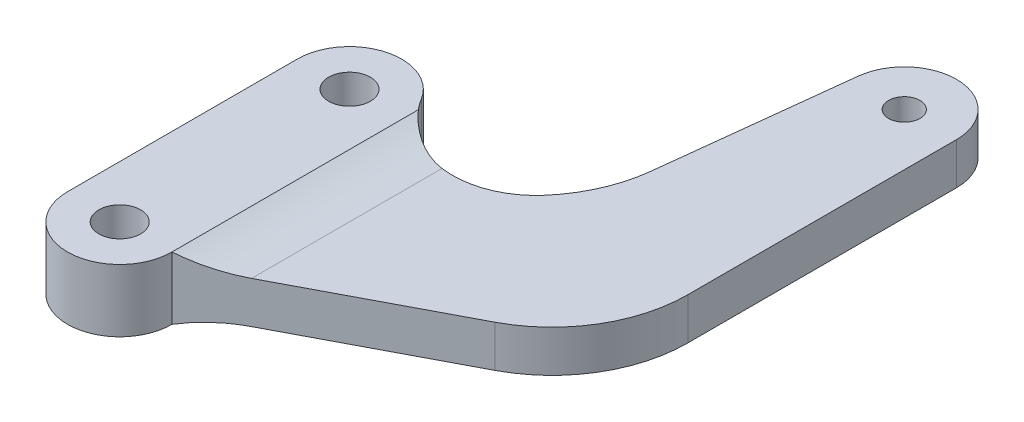
ISO-10303-21;
HEADER;
FILE_DESCRIPTION(('STEP AP214'),'2;1');
FILE_NAME('part.step','',(''),(''),'','','');
FILE_SCHEMA(('AUTOMOTIVE_DESIGN { 1 0 10303 214 1 1 1 1 }'));
ENDSEC;
DATA;
#1=APPLICATION_CONTEXT('core data for automotive mechanical design processes');
#2=APPLICATION_PROTOCOL_DEFINITION('international standard','automotive_design',2000,#1);
#3=PRODUCT_CONTEXT('',#1,'mechanical');
#4=PRODUCT('Part','Part','',(#3));
#5=PRODUCT_RELATED_PRODUCT_CATEGORY('part','',(#4));
#6=PRODUCT_DEFINITION_FORMATION('','',#4);
#7=PRODUCT_DEFINITION_CONTEXT('part definition',#1,'design');
#8=PRODUCT_DEFINITION('design','',#6,#7);
#9=PRODUCT_DEFINITION_SHAPE('','',#8);
#10=(LENGTH_UNIT() NAMED_UNIT(*) SI_UNIT(.MILLI.,.METRE.));
#11=(NAMED_UNIT(*) PLANE_ANGLE_UNIT() SI_UNIT($,.RADIAN.));
#12=(NAMED_UNIT(*) SI_UNIT($,.STERADIAN.) SOLID_ANGLE_UNIT());
#13=UNCERTAINTY_MEASURE_WITH_UNIT(LENGTH_MEASURE(1.E-05),#10,'distance_accuracy_value','');
#14=(GEOMETRIC_REPRESENTATION_CONTEXT(3) GLOBAL_UNCERTAINTY_ASSIGNED_CONTEXT((#13)) GLOBAL_UNIT_ASSIGNED_CONTEXT((#10,
#11,#12)) REPRESENTATION_CONTEXT('',''));
#15=CARTESIAN_POINT('',(0.,0.,0.));
#16=DIRECTION('',(0.,0.,1.));
#17=DIRECTION('',(1.,0.,0.));
#18=AXIS2_PLACEMENT_3D('',#15,#16,#17);
#19=CARTESIAN_POINT('',(0.,-3.,-11.));
#20=DIRECTION('',(0.,1.,0.));
#21=DIRECTION('',(0.,0.,1.));
#22=AXIS2_PLACEMENT_3D('',#19,#20,#21);
#23=CYLINDRICAL_SURFACE('',#22,5.);
#24=CARTESIAN_POINT('',(0.,3.,-11.));
#25=DIRECTION('',(0.,1.,0.));
#26=DIRECTION('',(0.,0.,1.));
#27=AXIS2_PLACEMENT_3D('',#24,#25,#26);
#28=CIRCLE('',#27,5.);
#29=CARTESIAN_POINT('',(4.2649345360818,3.,-13.6096615494996));
#30=VERTEX_POINT('',#29);
#31=CARTESIAN_POINT('',(-5.,3.,-11.));
#32=VERTEX_POINT('',#31);
#33=EDGE_CURVE('E181',#30,#32,#28,.T.);
#34=ORIENTED_EDGE('',*,*,#33,.F.);
#35=DIRECTION('',(0.,1.,0.));
#36=VECTOR('',#35,1.);
#37=CARTESIAN_POINT('',(4.2649345360818,-3.,-13.6096615494996));
#38=LINE('',#37,#36);
#39=CARTESIAN_POINT('',(4.2649345360818,-3.,-13.6096615494996));
#40=VERTEX_POINT('',#39);
#41=EDGE_CURVE('E244',#30,#40,#38,.F.);
#42=ORIENTED_EDGE('',*,*,#41,.T.);
#43=CARTESIAN_POINT('',(0.,-3.,-11.));
#44=DIRECTION('',(0.,1.,0.));
#45=DIRECTION('',(0.,0.,1.));
#46=AXIS2_PLACEMENT_3D('',#43,#44,#45);
#47=CIRCLE('',#46,5.);
#48=CARTESIAN_POINT('',(-5.,-3.,-11.));
#49=VERTEX_POINT('',#48);
#50=EDGE_CURVE('E198',#40,#49,#47,.T.);
#51=ORIENTED_EDGE('',*,*,#50,.T.);
#52=DIRECTION('',(0.,1.,0.));
#53=VECTOR('',#52,1.);
#54=CARTESIAN_POINT('',(-5.,-3.,-11.));
#55=LINE('',#54,#53);
#56=EDGE_CURVE('E210',#49,#32,#55,.T.);
#57=ORIENTED_EDGE('',*,*,#56,.T.);
#58=EDGE_LOOP('',(#34,#42,#51,#57));
#59=FACE_BOUND('',#58,.T.);
#60=ADVANCED_FACE('F35',(#59),#23,.T.);
#61=CARTESIAN_POINT('',(0.,-3.,11.));
#62=DIRECTION('',(0.,1.,0.));
#63=DIRECTION('',(0.,0.,1.));
#64=AXIS2_PLACEMENT_3D('',#61,#62,#63);
#65=CYLINDRICAL_SURFACE('',#64,5.);
#66=DIRECTION('',(0.,1.,0.));
#67=VECTOR('',#66,1.);
#68=CARTESIAN_POINT('',(5.,-3.,11.));
#69=LINE('',#68,#67);
#70=CARTESIAN_POINT('',(5.,-3.,11.));
#71=VERTEX_POINT('',#70);
#72=CARTESIAN_POINT('',(5.,3.,11.));
#73=VERTEX_POINT('',#72);
#74=EDGE_CURVE('E211',#71,#73,#69,.T.);
#75=ORIENTED_EDGE('',*,*,#74,.T.);
#76=CARTESIAN_POINT('',(0.,3.,11.));
#77=DIRECTION('',(0.,1.,0.));
#78=DIRECTION('',(0.,0.,1.));
#79=AXIS2_PLACEMENT_3D('',#76,#77,#78);
#80=CIRCLE('',#79,5.);
#81=CARTESIAN_POINT('',(-5.,3.,11.));
#82=VERTEX_POINT('',#81);
#83=EDGE_CURVE('E186',#82,#73,#80,.T.);
#84=ORIENTED_EDGE('',*,*,#83,.F.);
#85=DIRECTION('',(0.,1.,0.));
#86=VECTOR('',#85,1.);
#87=CARTESIAN_POINT('',(-5.,-3.,11.));
#88=LINE('',#87,#86);
#89=CARTESIAN_POINT('',(-5.,-3.,11.));
#90=VERTEX_POINT('',#89);
#91=EDGE_CURVE('E214',#90,#82,#88,.T.);
#92=ORIENTED_EDGE('',*,*,#91,.F.);
#93=CARTESIAN_POINT('',(0.,-3.,11.));
#94=DIRECTION('',(0.,1.,0.));
#95=DIRECTION('',(0.,0.,1.));
#96=AXIS2_PLACEMENT_3D('',#93,#94,#95);
#97=CIRCLE('',#96,5.);
#98=EDGE_CURVE('E203',#90,#71,#97,.T.);
#99=ORIENTED_EDGE('',*,*,#98,.T.);
#100=EDGE_LOOP('',(#75,#84,#92,#99));
#101=FACE_BOUND('',#100,.T.);
#102=ADVANCED_FACE('F280',(#101),#65,.T.);
#103=CARTESIAN_POINT('',(-5.,-3.,0.));
#104=DIRECTION('',(-1.,0.,0.));
#105=DIRECTION('',(0.,0.,1.));
#106=AXIS2_PLACEMENT_3D('',#103,#104,#105);
#107=PLANE('',#106);
#108=ORIENTED_EDGE('',*,*,#91,.T.);
#109=DIRECTION('',(0.,0.,1.));
#110=VECTOR('',#109,1.);
#111=CARTESIAN_POINT('',(-5.,3.,0.));
#112=LINE('',#111,#110);
#113=EDGE_CURVE('E183',#32,#82,#112,.T.);
#114=ORIENTED_EDGE('',*,*,#113,.F.);
#115=ORIENTED_EDGE('',*,*,#56,.F.);
#116=DIRECTION('',(0.,0.,1.));
#117=VECTOR('',#116,1.);
#118=CARTESIAN_POINT('',(-5.,-3.,0.));
#119=LINE('',#118,#117);
#120=EDGE_CURVE('E200',#49,#90,#119,.T.);
#121=ORIENTED_EDGE('',*,*,#120,.T.);
#122=EDGE_LOOP('',(#108,#114,#115,#121));
#123=FACE_BOUND('',#122,.T.);
#124=ADVANCED_FACE('F286',(#123),#107,.T.);
#125=CARTESIAN_POINT('',(0.,-3.,11.));
#126=DIRECTION('',(0.,1.,0.));
#127=DIRECTION('',(0.,0.,1.));
#128=AXIS2_PLACEMENT_3D('',#125,#126,#127);
#129=CYLINDRICAL_SURFACE('',#128,2.);
#130=CARTESIAN_POINT('',(0.,-3.,11.));
#131=DIRECTION('',(0.,1.,0.));
#132=DIRECTION('',(0.,0.,1.));
#133=AXIS2_PLACEMENT_3D('',#130,#131,#132);
#134=CIRCLE('',#133,2.);
#135=CARTESIAN_POINT('',(0.,-3.,13.));
#136=VERTEX_POINT('',#135);
#137=EDGE_CURVE('E195',#136,#136,#134,.T.);
#138=ORIENTED_EDGE('',*,*,#137,.F.);
#139=EDGE_LOOP('',(#138));
#140=FACE_BOUND('',#139,.T.);
#141=CARTESIAN_POINT('',(0.,3.,11.));
#142=DIRECTION('',(0.,1.,0.));
#143=DIRECTION('',(0.,0.,1.));
#144=AXIS2_PLACEMENT_3D('',#141,#142,#143);
#145=CIRCLE('',#144,2.);
#146=CARTESIAN_POINT('',(0.,3.,13.));
#147=VERTEX_POINT('',#146);
#148=EDGE_CURVE('E177',#147,#147,#145,.T.);
#149=ORIENTED_EDGE('',*,*,#148,.T.);
#150=EDGE_LOOP('',(#149));
#151=FACE_BOUND('',#150,.T.);
#152=ADVANCED_FACE('F291',(#140,#151),#129,.F.);
#153=CARTESIAN_POINT('',(0.,-3.,-11.));
#154=DIRECTION('',(0.,1.,0.));
#155=DIRECTION('',(0.,0.,1.));
#156=AXIS2_PLACEMENT_3D('',#153,#154,#155);
#157=CYLINDRICAL_SURFACE('',#156,2.);
#158=CARTESIAN_POINT('',(0.,-3.,-11.));
#159=DIRECTION('',(0.,1.,0.));
#160=DIRECTION('',(0.,0.,1.));
#161=AXIS2_PLACEMENT_3D('',#158,#159,#160);
#162=CIRCLE('',#161,2.);
#163=CARTESIAN_POINT('',(0.,-3.,-9.));
#164=VERTEX_POINT('',#163);
#165=EDGE_CURVE('E207',#164,#164,#162,.T.);
#166=ORIENTED_EDGE('',*,*,#165,.F.);
#167=EDGE_LOOP('',(#166));
#168=FACE_BOUND('',#167,.T.);
#169=CARTESIAN_POINT('',(0.,3.,-11.));
#170=DIRECTION('',(0.,1.,0.));
#171=DIRECTION('',(0.,0.,1.));
#172=AXIS2_PLACEMENT_3D('',#169,#170,#171);
#173=CIRCLE('',#172,2.);
#174=CARTESIAN_POINT('',(0.,3.,-9.));
#175=VERTEX_POINT('',#174);
#176=EDGE_CURVE('E192',#175,#175,#173,.T.);
#177=ORIENTED_EDGE('',*,*,#176,.T.);
#178=EDGE_LOOP('',(#177));
#179=FACE_BOUND('',#178,.T.);
#180=ADVANCED_FACE('F293',(#168,#179),#157,.F.);
#181=CARTESIAN_POINT('',(0.,-3.,0.));
#182=DIRECTION('',(0.,1.,0.));
#183=DIRECTION('',(0.,0.,1.));
#184=AXIS2_PLACEMENT_3D('',#181,#182,#183);
#185=PLANE('',#184);
#186=ORIENTED_EDGE('',*,*,#137,.T.);
#187=EDGE_LOOP('',(#186));
#188=FACE_BOUND('',#187,.T.);
#189=ORIENTED_EDGE('',*,*,#50,.F.);
#190=CARTESIAN_POINT('',(11.0888297938127,-3.,-17.785120028699));
#191=DIRECTION('',(0.,1.,0.));
#192=DIRECTION('',(0.,0.,1.));
#193=AXIS2_PLACEMENT_3D('',#190,#191,#192);
#194=CIRCLE('',#193,8.);
#195=CARTESIAN_POINT('',(5.,-3.,-12.5960785235673));
#196=VERTEX_POINT('',#195);
#197=EDGE_CURVE('E319',#40,#196,#194,.T.);
#198=ORIENTED_EDGE('',*,*,#197,.T.);
#199=DIRECTION('',(0.,0.,1.));
#200=VECTOR('',#199,1.);
#201=CARTESIAN_POINT('',(5.,-3.,0.));
#202=LINE('',#201,#200);
#203=EDGE_CURVE('E51',#196,#71,#202,.T.);
#204=ORIENTED_EDGE('',*,*,#203,.T.);
#205=ORIENTED_EDGE('',*,*,#98,.F.);
#206=ORIENTED_EDGE('',*,*,#120,.F.);
#207=EDGE_LOOP('',(#189,#198,#204,#205,#206));
#208=FACE_BOUND('',#207,.T.);
#209=ORIENTED_EDGE('',*,*,#165,.T.);
#210=EDGE_LOOP('',(#209));
#211=FACE_BOUND('',#210,.T.);
#212=ADVANCED_FACE('F299',(#188,#208,#211),#185,.F.);
#213=CARTESIAN_POINT('',(0.,3.,0.));
#214=DIRECTION('',(0.,1.,0.));
#215=DIRECTION('',(0.,0.,1.));
#216=AXIS2_PLACEMENT_3D('',#213,#214,#215);
#217=PLANE('',#216);
#218=ORIENTED_EDGE('',*,*,#148,.F.);
#219=EDGE_LOOP('',(#218));
#220=FACE_BOUND('',#219,.T.);
#221=DIRECTION('',(0.,0.,1.));
#222=VECTOR('',#221,1.);
#223=CARTESIAN_POINT('',(5.,3.,0.));
#224=LINE('',#223,#222);
#225=CARTESIAN_POINT('',(5.,3.,-12.5960785235673));
#226=VERTEX_POINT('',#225);
#227=EDGE_CURVE('E189',#226,#73,#224,.T.);
#228=ORIENTED_EDGE('',*,*,#227,.F.);
#229=CARTESIAN_POINT('',(11.0888297938127,3.,-17.785120028699));
#230=DIRECTION('',(0.,1.,0.));
#231=DIRECTION('',(0.,0.,1.));
#232=AXIS2_PLACEMENT_3D('',#229,#230,#231);
#233=CIRCLE('',#232,8.);
#234=EDGE_CURVE('E257',#226,#30,#233,.F.);
#235=ORIENTED_EDGE('',*,*,#234,.T.);
#236=ORIENTED_EDGE('',*,*,#33,.T.);
#237=ORIENTED_EDGE('',*,*,#113,.T.);
#238=ORIENTED_EDGE('',*,*,#83,.T.);
#239=EDGE_LOOP('',(#228,#235,#236,#237,#238));
#240=FACE_BOUND('',#239,.T.);
#241=ORIENTED_EDGE('',*,*,#176,.F.);
#242=EDGE_LOOP('',(#241));
#243=FACE_BOUND('',#242,.T.);
#244=ADVANCED_FACE('F307',(#220,#240,#243),#217,.T.);
#245=CARTESIAN_POINT('',(32.2390337656034,-2.,0.000317918521454837));
#246=DIRECTION('',(-0.999999999951377,0.,-9.86129186596697E-06));
#247=DIRECTION('',(-9.86129186596697E-06,0.,0.999999999951377));
#248=AXIS2_PLACEMENT_3D('',#245,#246,#247);
#249=PLANE('',#248);
#250=DIRECTION('',(-9.86129186596697E-06,0.,0.999999999951378));
#251=VECTOR('',#250,1.);
#252=CARTESIAN_POINT('',(32.2390337656034,2.,0.000317918521454837));
#253=LINE('',#252,#251);
#254=CARTESIAN_POINT('',(32.2393974859949,2.,-36.8833273902187));
#255=VERTEX_POINT('',#254);
#256=CARTESIAN_POINT('',(32.2391437631779,2.,-11.1541612274217));
#257=VERTEX_POINT('',#256);
#258=EDGE_CURVE('E135',#255,#257,#253,.T.);
#259=ORIENTED_EDGE('',*,*,#258,.T.);
#260=DIRECTION('',(0.,1.,0.));
#261=VECTOR('',#260,1.);
#262=CARTESIAN_POINT('',(32.2391437631779,-2.,-11.1541612274217));
#263=LINE('',#262,#261);
#264=CARTESIAN_POINT('',(32.2391437631779,-2.,-11.1541612274217));
#265=VERTEX_POINT('',#264);
#266=EDGE_CURVE('E227',#257,#265,#263,.F.);
#267=ORIENTED_EDGE('',*,*,#266,.T.);
#268=DIRECTION('',(-9.86129186596697E-06,0.,0.999999999951378));
#269=VECTOR('',#268,1.);
#270=CARTESIAN_POINT('',(32.2390337656034,-2.,0.000317918521454837));
#271=LINE('',#270,#269);
#272=CARTESIAN_POINT('',(32.2393974859949,-2.,-36.8833273902187));
#273=VERTEX_POINT('',#272);
#274=EDGE_CURVE('E138',#273,#265,#271,.T.);
#275=ORIENTED_EDGE('',*,*,#274,.F.);
#276=DIRECTION('',(0.,1.,0.));
#277=VECTOR('',#276,1.);
#278=CARTESIAN_POINT('',(32.2393974859949,-2.,-36.8833273902187));
#279=LINE('',#278,#277);
#280=EDGE_CURVE('E131',#273,#255,#279,.T.);
#281=ORIENTED_EDGE('',*,*,#280,.T.);
#282=EDGE_LOOP('',(#259,#267,#275,#281));
#283=FACE_BOUND('',#282,.T.);
#284=ADVANCED_FACE('F133',(#283),#249,.F.);
#285=CARTESIAN_POINT('',(5.60597292340619,-2.,10.6819814935088));
#286=DIRECTION('',(-0.464699550810545,0.,-0.885468422630914));
#287=DIRECTION('',(-0.885468422630914,0.,0.464699550810545));
#288=AXIS2_PLACEMENT_3D('',#285,#286,#287);
#289=PLANE('',#288);
#290=DIRECTION('',(-0.885468422630914,0.,0.464699550810545));
#291=VECTOR('',#290,1.);
#292=CARTESIAN_POINT('',(5.60597292340619,-2.,10.6819814935088));
#293=LINE('',#292,#291);
#294=CARTESIAN_POINT('',(25.280237924347,-2.,0.356800069985893));
#295=VERTEX_POINT('',#294);
#296=CARTESIAN_POINT('',(10.,-2.,8.37596768595189));
#297=VERTEX_POINT('',#296);
#298=EDGE_CURVE('E173',#295,#297,#293,.T.);
#299=ORIENTED_EDGE('',*,*,#298,.F.);
#300=DIRECTION('',(0.,1.,0.));
#301=VECTOR('',#300,1.);
#302=CARTESIAN_POINT('',(25.280237924347,-2.,0.356800069985893));
#303=LINE('',#302,#301);
#304=CARTESIAN_POINT('',(25.280237924347,2.,0.356800069985893));
#305=VERTEX_POINT('',#304);
#306=EDGE_CURVE('E224',#295,#305,#303,.T.);
#307=ORIENTED_EDGE('',*,*,#306,.T.);
#308=DIRECTION('',(-0.885468422630914,0.,0.464699550810545));
#309=VECTOR('',#308,1.);
#310=CARTESIAN_POINT('',(5.60597292340619,2.,10.6819814935088));
#311=LINE('',#310,#309);
#312=CARTESIAN_POINT('',(10.,2.,8.37596768595189));
#313=VERTEX_POINT('',#312);
#314=EDGE_CURVE('E161',#305,#313,#311,.T.);
#315=ORIENTED_EDGE('',*,*,#314,.T.);
#316=CARTESIAN_POINT('',(10.,15.,8.37596768595189));
#317=DIRECTION('',(-0.464699550810545,0.,-0.885468422630914));
#318=DIRECTION('',(0.885468422630914,0.,-0.464699550810545));
#319=AXIS2_PLACEMENT_3D('',#316,#317,#318);
#320=ELLIPSE('',#319,14.6814947520932,13.);
#321=EDGE_CURVE('E234',#313,#73,#320,.T.);
#322=ORIENTED_EDGE('',*,*,#321,.T.);
#323=ORIENTED_EDGE('',*,*,#74,.F.);
#324=CARTESIAN_POINT('',(10.,-15.,8.37596768595189));
#325=DIRECTION('',(-0.464699550810545,0.,-0.885468422630914));
#326=DIRECTION('',(0.885468422630914,0.,-0.464699550810545));
#327=AXIS2_PLACEMENT_3D('',#324,#325,#326);
#328=ELLIPSE('',#327,14.6814947520932,13.);
#329=EDGE_CURVE('E232',#71,#297,#328,.T.);
#330=ORIENTED_EDGE('',*,*,#329,.T.);
#331=EDGE_LOOP('',(#299,#307,#315,#322,#323,#330));
#332=FACE_BOUND('',#331,.T.);
#333=ADVANCED_FACE('F337',(#332),#289,.F.);
#334=CARTESIAN_POINT('',(17.7559213878396,-2.,2.03086150987237));
#335=DIRECTION('',(-0.993522484630147,0.,-0.11363570096734));
#336=DIRECTION('',(-0.11363570096734,0.,0.993522484630147));
#337=AXIS2_PLACEMENT_3D('',#334,#335,#336);
#338=PLANE('',#337);
#339=DIRECTION('',(-0.11363570096734,0.,0.993522484630147));
#340=VECTOR('',#339,1.);
#341=CARTESIAN_POINT('',(17.7559213878396,-2.,2.03086150987237));
#342=LINE('',#341,#340);
#343=CARTESIAN_POINT('',(22.2717850630872,-2.,-37.4515552015147));
#344=VERTEX_POINT('',#343);
#345=CARTESIAN_POINT('',(20.2282593604993,-2.,-19.5849101581209));
#346=VERTEX_POINT('',#345);
#347=EDGE_CURVE('E170',#344,#346,#342,.T.);
#348=ORIENTED_EDGE('',*,*,#347,.T.);
#349=DIRECTION('',(0.,1.,0.));
#350=VECTOR('',#349,1.);
#351=CARTESIAN_POINT('',(20.2282593604993,-2.,-19.5849101581209));
#352=LINE('',#351,#350);
#353=CARTESIAN_POINT('',(20.2282593604993,2.,-19.5849101581209));
#354=VERTEX_POINT('',#353);
#355=EDGE_CURVE('E229',#346,#354,#352,.T.);
#356=ORIENTED_EDGE('',*,*,#355,.T.);
#357=DIRECTION('',(-0.11363570096734,0.,0.993522484630147));
#358=VECTOR('',#357,1.);
#359=CARTESIAN_POINT('',(17.7559213878396,2.,2.03086150987237));
#360=LINE('',#359,#358);
#361=CARTESIAN_POINT('',(22.2717850630872,2.,-37.4515552015147));
#362=VERTEX_POINT('',#361);
#363=EDGE_CURVE('E151',#362,#354,#360,.T.);
#364=ORIENTED_EDGE('',*,*,#363,.F.);
#365=DIRECTION('',(0.,1.,0.));
#366=VECTOR('',#365,1.);
#367=CARTESIAN_POINT('',(22.2717850630872,-2.,-37.4515552015147));
#368=LINE('',#367,#366);
#369=EDGE_CURVE('E142',#344,#362,#368,.T.);
#370=ORIENTED_EDGE('',*,*,#369,.F.);
#371=EDGE_LOOP('',(#348,#356,#364,#370));
#372=FACE_BOUND('',#371,.T.);
#373=ADVANCED_FACE('F334',(#372),#338,.T.);
#374=CARTESIAN_POINT('',(27.239397486238,-2.,-36.883376696678));
#375=DIRECTION('',(0.,1.,0.));
#376=DIRECTION('',(0.,0.,1.));
#377=AXIS2_PLACEMENT_3D('',#374,#375,#376);
#378=CYLINDRICAL_SURFACE('',#377,5.);
#379=ORIENTED_EDGE('',*,*,#369,.T.);
#380=CARTESIAN_POINT('',(27.239397486238,2.,-36.883376696678));
#381=DIRECTION('',(0.,1.,0.));
#382=DIRECTION('',(0.,0.,1.));
#383=AXIS2_PLACEMENT_3D('',#380,#381,#382);
#384=CIRCLE('',#383,5.);
#385=EDGE_CURVE('E146',#255,#362,#384,.T.);
#386=ORIENTED_EDGE('',*,*,#385,.F.);
#387=ORIENTED_EDGE('',*,*,#280,.F.);
#388=CARTESIAN_POINT('',(27.239397486238,-2.,-36.883376696678));
#389=DIRECTION('',(0.,1.,0.));
#390=DIRECTION('',(0.,0.,1.));
#391=AXIS2_PLACEMENT_3D('',#388,#389,#390);
#392=CIRCLE('',#391,5.);
#393=EDGE_CURVE('E168',#273,#344,#392,.T.);
#394=ORIENTED_EDGE('',*,*,#393,.T.);
#395=EDGE_LOOP('',(#379,#386,#387,#394));
#396=FACE_BOUND('',#395,.T.);
#397=ADVANCED_FACE('F147',(#396),#378,.T.);
#398=CARTESIAN_POINT('',(27.239397486238,-2.,-36.883376696678));
#399=DIRECTION('',(0.,1.,0.));
#400=DIRECTION('',(0.,0.,1.));
#401=AXIS2_PLACEMENT_3D('',#398,#399,#400);
#402=CYLINDRICAL_SURFACE('',#401,1.5);
#403=CARTESIAN_POINT('',(27.239397486238,-2.,-36.883376696678));
#404=DIRECTION('',(0.,1.,0.));
#405=DIRECTION('',(0.,0.,1.));
#406=AXIS2_PLACEMENT_3D('',#403,#404,#405);
#407=CIRCLE('',#406,1.5);
#408=CARTESIAN_POINT('',(27.239397486238,-2.,-35.383376696678));
#409=VERTEX_POINT('',#408);
#410=EDGE_CURVE('E143',#409,#409,#407,.T.);
#411=ORIENTED_EDGE('',*,*,#410,.F.);
#412=EDGE_LOOP('',(#411));
#413=FACE_BOUND('',#412,.T.);
#414=CARTESIAN_POINT('',(27.239397486238,2.,-36.883376696678));
#415=DIRECTION('',(0.,1.,0.));
#416=DIRECTION('',(0.,0.,1.));
#417=AXIS2_PLACEMENT_3D('',#414,#415,#416);
#418=CIRCLE('',#417,1.5);
#419=CARTESIAN_POINT('',(27.239397486238,2.,-35.383376696678));
#420=VERTEX_POINT('',#419);
#421=EDGE_CURVE('E164',#420,#420,#418,.T.);
#422=ORIENTED_EDGE('',*,*,#421,.T.);
#423=EDGE_LOOP('',(#422));
#424=FACE_BOUND('',#423,.T.);
#425=ADVANCED_FACE('F357',(#413,#424),#402,.F.);
#426=CARTESIAN_POINT('',(0.,-2.,0.));
#427=DIRECTION('',(0.,1.,0.));
#428=DIRECTION('',(0.,0.,1.));
#429=AXIS2_PLACEMENT_3D('',#426,#427,#428);
#430=PLANE('',#429);
#431=ORIENTED_EDGE('',*,*,#298,.T.);
#432=DIRECTION('',(0.,0.,-1.));
#433=VECTOR('',#432,1.);
#434=CARTESIAN_POINT('',(10.,-2.,0.));
#435=LINE('',#434,#433);
#436=CARTESIAN_POINT('',(10.,-2.,-9.8595632861032));
#437=VERTEX_POINT('',#436);
#438=EDGE_CURVE('E58',#297,#437,#435,.T.);
#439=ORIENTED_EDGE('',*,*,#438,.T.);
#440=CARTESIAN_POINT('',(11.0888297938127,-2.,-17.785120028699));
#441=DIRECTION('',(0.,1.,0.));
#442=DIRECTION('',(0.,0.,1.));
#443=AXIS2_PLACEMENT_3D('',#440,#441,#442);
#444=CIRCLE('',#443,8.);
#445=CARTESIAN_POINT('',(17.1310101674211,-2.,-12.5418332415033));
#446=VERTEX_POINT('',#445);
#447=EDGE_CURVE('E11',#437,#446,#444,.T.);
#448=ORIENTED_EDGE('',*,*,#447,.T.);
#449=CARTESIAN_POINT('',(7.3124670603074,-2.,-21.0621742706963));
#450=DIRECTION('',(0.,1.,0.));
#451=DIRECTION('',(0.,0.,1.));
#452=AXIS2_PLACEMENT_3D('',#449,#450,#451);
#453=CIRCLE('',#452,13.);
#454=EDGE_CURVE('E239',#446,#346,#453,.T.);
#455=ORIENTED_EDGE('',*,*,#454,.T.);
#456=ORIENTED_EDGE('',*,*,#347,.F.);
#457=ORIENTED_EDGE('',*,*,#393,.F.);
#458=ORIENTED_EDGE('',*,*,#274,.T.);
#459=CARTESIAN_POINT('',(19.2391437638099,-2.,-11.154289424216));
#460=DIRECTION('',(0.,1.,0.));
#461=DIRECTION('',(0.,0.,1.));
#462=AXIS2_PLACEMENT_3D('',#459,#460,#461);
#463=CIRCLE('',#462,13.);
#464=EDGE_CURVE('E213',#265,#295,#463,.F.);
#465=ORIENTED_EDGE('',*,*,#464,.T.);
#466=EDGE_LOOP('',(#431,#439,#448,#455,#456,#457,#458,#465));
#467=FACE_BOUND('',#466,.T.);
#468=ORIENTED_EDGE('',*,*,#410,.T.);
#469=EDGE_LOOP('',(#468));
#470=FACE_BOUND('',#469,.T.);
#471=ADVANCED_FACE('F329',(#467,#470),#430,.F.);
#472=CARTESIAN_POINT('',(0.,2.,0.));
#473=DIRECTION('',(0.,1.,0.));
#474=DIRECTION('',(0.,0.,1.));
#475=AXIS2_PLACEMENT_3D('',#472,#473,#474);
#476=PLANE('',#475);
#477=CARTESIAN_POINT('',(7.3124670603074,2.,-21.0621742706963));
#478=DIRECTION('',(0.,1.,0.));
#479=DIRECTION('',(0.,0.,1.));
#480=AXIS2_PLACEMENT_3D('',#477,#478,#479);
#481=CIRCLE('',#480,13.);
#482=CARTESIAN_POINT('',(17.1310101674211,2.,-12.5418332415033));
#483=VERTEX_POINT('',#482);
#484=EDGE_CURVE('E237',#354,#483,#481,.F.);
#485=ORIENTED_EDGE('',*,*,#484,.T.);
#486=CARTESIAN_POINT('',(11.0888297938127,2.,-17.785120028699));
#487=DIRECTION('',(0.,1.,0.));
#488=DIRECTION('',(0.,0.,1.));
#489=AXIS2_PLACEMENT_3D('',#486,#487,#488);
#490=CIRCLE('',#489,8.);
#491=CARTESIAN_POINT('',(10.,2.,-9.8595632861032));
#492=VERTEX_POINT('',#491);
#493=EDGE_CURVE('E246',#483,#492,#490,.F.);
#494=ORIENTED_EDGE('',*,*,#493,.T.);
#495=DIRECTION('',(0.,0.,1.));
#496=VECTOR('',#495,1.);
#497=CARTESIAN_POINT('',(10.,2.,11.));
#498=LINE('',#497,#496);
#499=EDGE_CURVE('E221',#492,#313,#498,.T.);
#500=ORIENTED_EDGE('',*,*,#499,.T.);
#501=ORIENTED_EDGE('',*,*,#314,.F.);
#502=CARTESIAN_POINT('',(19.2391437638099,2.,-11.154289424216));
#503=DIRECTION('',(0.,1.,0.));
#504=DIRECTION('',(0.,0.,1.));
#505=AXIS2_PLACEMENT_3D('',#502,#503,#504);
#506=CIRCLE('',#505,13.);
#507=EDGE_CURVE('E157',#305,#257,#506,.T.);
#508=ORIENTED_EDGE('',*,*,#507,.T.);
#509=ORIENTED_EDGE('',*,*,#258,.F.);
#510=ORIENTED_EDGE('',*,*,#385,.T.);
#511=ORIENTED_EDGE('',*,*,#363,.T.);
#512=EDGE_LOOP('',(#485,#494,#500,#501,#508,#509,#510,#511));
#513=FACE_BOUND('',#512,.T.);
#514=ORIENTED_EDGE('',*,*,#421,.F.);
#515=EDGE_LOOP('',(#514));
#516=FACE_BOUND('',#515,.T.);
#517=ADVANCED_FACE('F154',(#513,#516),#476,.T.);
#518=CARTESIAN_POINT('',(10.,-15.,0.));
#519=DIRECTION('',(0.,0.,-1.));
#520=DIRECTION('',(-1.,0.,0.));
#521=AXIS2_PLACEMENT_3D('',#518,#519,#520);
#522=CYLINDRICAL_SURFACE('',#521,13.);
#523=ORIENTED_EDGE('',*,*,#203,.F.);
#524=CARTESIAN_POINT('',(5.00000000000001,-3.,-12.5960785235673));
#525=CARTESIAN_POINT('',(5.14088789023977,-2.94128474943051,-12.4307639228618));
#526=CARTESIAN_POINT('',(5.2885388931835,-2.88268672464854,-12.2711451107103));
#527=CARTESIAN_POINT('',(5.59678523318252,-2.76730950439307,-11.9640537090843));
#528=CARTESIAN_POINT('',(5.75738714128744,-2.71053125291557,-11.8165873632464));
#529=CARTESIAN_POINT('',(6.09203742623577,-2.60003533849656,-11.5336869075232));
#530=CARTESIAN_POINT('',(6.26617621963961,-2.54634333000237,-11.3983495357625));
#531=CARTESIAN_POINT('',(6.62602344553009,-2.4440750180496,-11.1419160768427));
#532=CARTESIAN_POINT('',(6.8117297098234,-2.39549776045305,-11.0208173330262));
#533=CARTESIAN_POINT('',(7.19457403423205,-2.30478671117858,-10.7933715293673));
#534=CARTESIAN_POINT('',(7.3917562924905,-2.26268046502387,-10.687087702184));
#535=CARTESIAN_POINT('',(7.7956209460488,-2.18661187033418,-10.4909338783817));
#536=CARTESIAN_POINT('',(8.00230201227333,-2.15264838657129,-10.4010615941548));
#537=CARTESIAN_POINT('',(8.42269114595265,-2.0943066082417,-10.2391138274354));
#538=CARTESIAN_POINT('',(8.63636122613974,-2.06988360620719,-10.1669559400943));
#539=CARTESIAN_POINT('',(9.06979420863817,-2.03150104040943,-10.0408087076749));
#540=CARTESIAN_POINT('',(9.28955194660444,-2.01753287332428,-9.98680444412015));
#541=CARTESIAN_POINT('',(9.59229358645856,-2.00614129799887,-9.9259077547058));
#542=CARTESIAN_POINT('',(9.67353642472345,-2.003844119719,-9.91087225969668));
#543=CARTESIAN_POINT('',(9.83645733620362,-2.00077371553487,-9.8833239640786));
#544=CARTESIAN_POINT('',(9.91813530109321,-2.00000012661712,-9.87081056318837));
#545=CARTESIAN_POINT('',(10.,-2.,-9.8595632861032));
#546=B_SPLINE_CURVE_WITH_KNOTS('',3,(#524,#525,#526,#527,#528,#529,#530,#531,#532,#533,#534,
#535,#536,#537,#538,#539,#540,#541,#542,#543,#544,#545),.UNSPECIFIED.,.F.,.F.,(4,2,2,2,2,2,2,2,
2,2,4),(0.,0.674863054411916,1.35007070271252,2.0302570377843,2.71031626094762,3.39319460274957,
4.07597768523973,4.75552166714523,5.43450583315327,5.68242745815833,5.93029000570692),.UNSPECIFIED.);
#547=EDGE_CURVE('E44',#196,#437,#546,.T.);
#548=ORIENTED_EDGE('',*,*,#547,.T.);
#549=ORIENTED_EDGE('',*,*,#438,.F.);
#550=ORIENTED_EDGE('',*,*,#329,.F.);
#551=EDGE_LOOP('',(#523,#548,#549,#550));
#552=FACE_BOUND('',#551,.T.);
#553=ADVANCED_FACE('F265',(#552),#522,.F.);
#554=CARTESIAN_POINT('',(10.,15.,0.));
#555=DIRECTION('',(0.,0.,-1.));
#556=DIRECTION('',(-1.,0.,0.));
#557=AXIS2_PLACEMENT_3D('',#554,#555,#556);
#558=CYLINDRICAL_SURFACE('',#557,13.);
#559=ORIENTED_EDGE('',*,*,#499,.F.);
#560=CARTESIAN_POINT('',(10.,2.,-9.8595632861032));
#561=CARTESIAN_POINT('',(9.79282445964805,1.99995824830845,-9.88798584119537));
#562=CARTESIAN_POINT('',(9.58681423099466,2.00495078651792,-9.92460195255699));
#563=CARTESIAN_POINT('',(9.17882777246079,2.02436649772385,-10.0136792949644));
#564=CARTESIAN_POINT('',(8.97684913375734,2.03878385443325,-10.0661307428983));
#565=CARTESIAN_POINT('',(8.57927026251097,2.07632774305434,-10.1861013936108));
#566=CARTESIAN_POINT('',(8.3836453301599,2.0994146228699,-10.2535514324731));
#567=CARTESIAN_POINT('',(7.99912930442816,2.15343639598485,-10.4029597692578));
#568=CARTESIAN_POINT('',(7.81023886969325,2.18437205452038,-10.4849194816011));
#569=CARTESIAN_POINT('',(7.4407692000788,2.25301705036809,-10.6623701519147));
#570=CARTESIAN_POINT('',(7.26017195041046,2.29071073907626,-10.7578297445056));
#571=CARTESIAN_POINT('',(6.90774518446309,2.37183063825947,-10.9616332285115));
#572=CARTESIAN_POINT('',(6.73591635603749,2.41525729751135,-11.0699781285224));
#573=CARTESIAN_POINT('',(6.40179841484702,2.50668373782489,-11.2987696756748));
#574=CARTESIAN_POINT('',(6.23950996122219,2.55468383426416,-11.4192171574241));
#575=CARTESIAN_POINT('',(5.92511356863417,2.65405005099894,-11.6714752757261));
#576=CARTESIAN_POINT('',(5.77300566395432,2.70541618262853,-11.8032859505412));
#577=CARTESIAN_POINT('',(5.51551250535945,2.79740968614178,-12.0439418015985));
#578=CARTESIAN_POINT('',(5.40781280000365,2.83758359793426,-12.1504981161868));
#579=CARTESIAN_POINT('',(5.19900195596131,2.91848786194333,-12.3691514556205));
#580=CARTESIAN_POINT('',(5.09787541104711,2.95921662082348,-12.4812343553977));
#581=CARTESIAN_POINT('',(5.00000000000001,3.,-12.5960785235673));
#582=B_SPLINE_CURVE_WITH_KNOTS('',3,(#560,#561,#562,#563,#564,#565,#566,#567,#568,#569,#570,
#571,#572,#573,#574,#575,#576,#577,#578,#579,#580,#581),.UNSPECIFIED.,.F.,.F.,(4,2,2,2,2,2,2,2,
2,2,4),(0.,0.627066769441233,1.25374692542738,1.87759504917826,2.50150401993675,
3.12398652628986,3.74651778949012,4.36909201265864,4.99166833226109,5.46166151755264,
5.93051014205061),.UNSPECIFIED.);
#583=EDGE_CURVE('E249',#492,#226,#582,.T.);
#584=ORIENTED_EDGE('',*,*,#583,.T.);
#585=ORIENTED_EDGE('',*,*,#227,.T.);
#586=ORIENTED_EDGE('',*,*,#321,.F.);
#587=EDGE_LOOP('',(#559,#584,#585,#586));
#588=FACE_BOUND('',#587,.T.);
#589=ADVANCED_FACE('F259',(#588),#558,.F.);
#590=CARTESIAN_POINT('',(19.2391437638099,-2.,-11.154289424216));
#591=DIRECTION('',(0.,1.,0.));
#592=DIRECTION('',(0.,0.,1.));
#593=AXIS2_PLACEMENT_3D('',#590,#591,#592);
#594=CYLINDRICAL_SURFACE('',#593,13.);
#595=ORIENTED_EDGE('',*,*,#464,.F.);
#596=ORIENTED_EDGE('',*,*,#266,.F.);
#597=ORIENTED_EDGE('',*,*,#507,.F.);
#598=ORIENTED_EDGE('',*,*,#306,.F.);
#599=EDGE_LOOP('',(#595,#596,#597,#598));
#600=FACE_BOUND('',#599,.T.);
#601=ADVANCED_FACE('F264',(#600),#594,.T.);
#602=CARTESIAN_POINT('',(7.3124670603074,-2.,-21.0621742706963));
#603=DIRECTION('',(0.,1.,0.));
#604=DIRECTION('',(0.,0.,1.));
#605=AXIS2_PLACEMENT_3D('',#602,#603,#604);
#606=CYLINDRICAL_SURFACE('',#605,13.);
#607=ORIENTED_EDGE('',*,*,#454,.F.);
#608=DIRECTION('',(0.,1.,0.));
#609=VECTOR('',#608,1.);
#610=CARTESIAN_POINT('',(17.1310101674211,-2.,-12.5418332415033));
#611=LINE('',#610,#609);
#612=EDGE_CURVE('E241',#446,#483,#611,.T.);
#613=ORIENTED_EDGE('',*,*,#612,.T.);
#614=ORIENTED_EDGE('',*,*,#484,.F.);
#615=ORIENTED_EDGE('',*,*,#355,.F.);
#616=EDGE_LOOP('',(#607,#613,#614,#615));
#617=FACE_BOUND('',#616,.T.);
#618=ADVANCED_FACE('F270',(#617),#606,.F.);
#619=CARTESIAN_POINT('',(11.0888297938127,-3.,-17.785120028699));
#620=DIRECTION('',(0.,1.,0.));
#621=DIRECTION('',(0.,0.,1.));
#622=AXIS2_PLACEMENT_3D('',#619,#620,#621);
#623=CYLINDRICAL_SURFACE('',#622,8.);
#624=ORIENTED_EDGE('',*,*,#197,.F.);
#625=ORIENTED_EDGE('',*,*,#41,.F.);
#626=ORIENTED_EDGE('',*,*,#234,.F.);
#627=ORIENTED_EDGE('',*,*,#583,.F.);
#628=ORIENTED_EDGE('',*,*,#493,.F.);
#629=ORIENTED_EDGE('',*,*,#612,.F.);
#630=ORIENTED_EDGE('',*,*,#447,.F.);
#631=ORIENTED_EDGE('',*,*,#547,.F.);
#632=EDGE_LOOP('',(#624,#625,#626,#627,#628,#629,#630,#631));
#633=FACE_BOUND('',#632,.T.);
#634=ADVANCED_FACE('F37',(#633),#623,.F.);
#635=CLOSED_SHELL('',(#60,#102,#124,#152,#180,#212,#244,#284,#333,#373,#397,#425,#471,#517,#553,
#589,#601,#618,#634));
#636=MANIFOLD_SOLID_BREP('B2',#635);
#637=ADVANCED_BREP_SHAPE_REPRESENTATION('',(#18,#636),#14);
#638=SHAPE_DEFINITION_REPRESENTATION(#9,#637);
ENDSEC;
END-ISO-10303-21;
